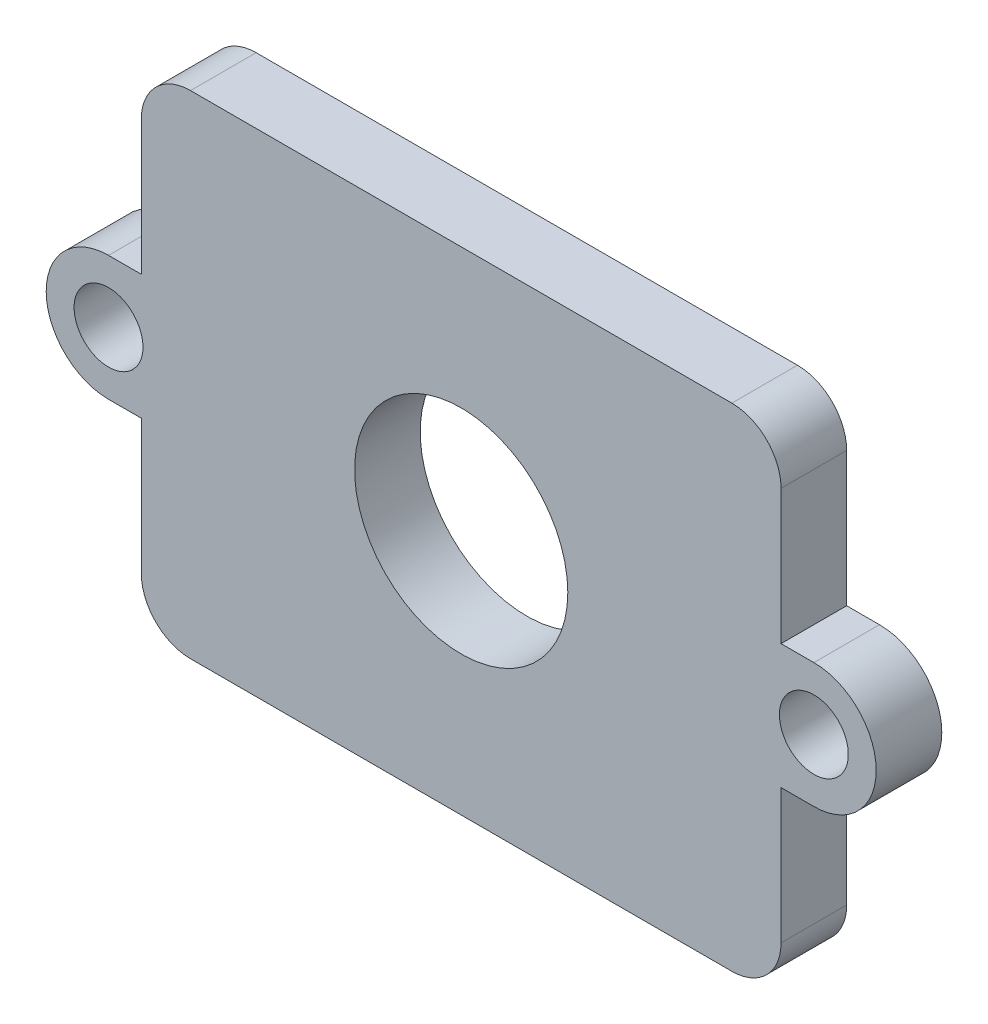
ISO-10303-21;
HEADER;
FILE_DESCRIPTION(('STEP AP214'),'2;1');
FILE_NAME('part.step','',(''),(''),'','','');
FILE_SCHEMA(('AUTOMOTIVE_DESIGN { 1 0 10303 214 1 1 1 1 }'));
ENDSEC;
DATA;
#1=APPLICATION_CONTEXT('core data for automotive mechanical design processes');
#2=APPLICATION_PROTOCOL_DEFINITION('international standard','automotive_design',2000,#1);
#3=PRODUCT_CONTEXT('',#1,'mechanical');
#4=PRODUCT('Part','Part','',(#3));
#5=PRODUCT_RELATED_PRODUCT_CATEGORY('part','',(#4));
#6=PRODUCT_DEFINITION_FORMATION('','',#4);
#7=PRODUCT_DEFINITION_CONTEXT('part definition',#1,'design');
#8=PRODUCT_DEFINITION('design','',#6,#7);
#9=PRODUCT_DEFINITION_SHAPE('','',#8);
#10=(LENGTH_UNIT() NAMED_UNIT(*) SI_UNIT(.MILLI.,.METRE.));
#11=(NAMED_UNIT(*) PLANE_ANGLE_UNIT() SI_UNIT($,.RADIAN.));
#12=(NAMED_UNIT(*) SI_UNIT($,.STERADIAN.) SOLID_ANGLE_UNIT());
#13=UNCERTAINTY_MEASURE_WITH_UNIT(LENGTH_MEASURE(1.E-05),#10,'distance_accuracy_value','');
#14=(GEOMETRIC_REPRESENTATION_CONTEXT(3) GLOBAL_UNCERTAINTY_ASSIGNED_CONTEXT((#13)) GLOBAL_UNIT_ASSIGNED_CONTEXT((#10,
#11,#12)) REPRESENTATION_CONTEXT('',''));
#15=CARTESIAN_POINT('',(0.,0.,0.));
#16=DIRECTION('',(0.,0.,1.));
#17=DIRECTION('',(1.,0.,0.));
#18=AXIS2_PLACEMENT_3D('',#15,#16,#17);
#19=CARTESIAN_POINT('',(0.,0.,4.));
#20=DIRECTION('',(0.,0.,1.));
#21=DIRECTION('',(1.,0.,0.));
#22=AXIS2_PLACEMENT_3D('',#19,#20,#21);
#23=PLANE('',#22);
#24=CARTESIAN_POINT('',(21.5,0.,4.));
#25=DIRECTION('',(0.,0.,-1.));
#26=DIRECTION('',(-1.,0.,0.));
#27=AXIS2_PLACEMENT_3D('',#24,#25,#26);
#28=CIRCLE('',#27,2.1);
#29=CARTESIAN_POINT('',(19.4,0.,4.));
#30=VERTEX_POINT('',#29);
#31=EDGE_CURVE('E332',#30,#30,#28,.T.);
#32=ORIENTED_EDGE('',*,*,#31,.T.);
#33=EDGE_LOOP('',(#32));
#34=FACE_BOUND('',#33,.T.);
#35=CARTESIAN_POINT('',(-21.5,0.,4.));
#36=DIRECTION('',(0.,0.,1.));
#37=DIRECTION('',(1.,0.,0.));
#38=AXIS2_PLACEMENT_3D('',#35,#36,#37);
#39=CIRCLE('',#38,2.1);
#40=CARTESIAN_POINT('',(-19.4,0.,4.));
#41=VERTEX_POINT('',#40);
#42=EDGE_CURVE('E326',#41,#41,#39,.T.);
#43=ORIENTED_EDGE('',*,*,#42,.F.);
#44=EDGE_LOOP('',(#43));
#45=FACE_BOUND('',#44,.T.);
#46=DIRECTION('',(1.,0.,0.));
#47=VECTOR('',#46,1.);
#48=CARTESIAN_POINT('',(-19.5,-15.,4.));
#49=LINE('',#48,#47);
#50=CARTESIAN_POINT('',(-16.5,-15.,4.));
#51=VERTEX_POINT('',#50);
#52=CARTESIAN_POINT('',(16.5,-15.,4.));
#53=VERTEX_POINT('',#52);
#54=EDGE_CURVE('E191',#51,#53,#49,.T.);
#55=ORIENTED_EDGE('',*,*,#54,.T.);
#56=CARTESIAN_POINT('',(16.5,-12.,4.));
#57=DIRECTION('',(0.,0.,1.));
#58=DIRECTION('',(1.,0.,0.));
#59=AXIS2_PLACEMENT_3D('',#56,#57,#58);
#60=CIRCLE('',#59,3.);
#61=CARTESIAN_POINT('',(19.5,-12.,4.));
#62=VERTEX_POINT('',#61);
#63=EDGE_CURVE('E257',#53,#62,#60,.T.);
#64=ORIENTED_EDGE('',*,*,#63,.T.);
#65=DIRECTION('',(0.,1.,0.));
#66=VECTOR('',#65,1.);
#67=CARTESIAN_POINT('',(19.5,-3.79999999999999,4.));
#68=LINE('',#67,#66);
#69=CARTESIAN_POINT('',(19.5,-3.79999999999999,4.));
#70=VERTEX_POINT('',#69);
#71=EDGE_CURVE('E177',#62,#70,#68,.T.);
#72=ORIENTED_EDGE('',*,*,#71,.T.);
#73=DIRECTION('',(1.,0.,0.));
#74=VECTOR('',#73,1.);
#75=CARTESIAN_POINT('',(21.5,-3.8,4.));
#76=LINE('',#75,#74);
#77=CARTESIAN_POINT('',(21.5,-3.8,4.));
#78=VERTEX_POINT('',#77);
#79=EDGE_CURVE('E166',#70,#78,#76,.T.);
#80=ORIENTED_EDGE('',*,*,#79,.T.);
#81=CARTESIAN_POINT('',(21.5,0.,4.));
#82=DIRECTION('',(0.,0.,-1.));
#83=DIRECTION('',(-1.,0.,0.));
#84=AXIS2_PLACEMENT_3D('',#81,#82,#83);
#85=CIRCLE('',#84,3.79999999999999);
#86=CARTESIAN_POINT('',(21.5,3.79999999999998,4.));
#87=VERTEX_POINT('',#86);
#88=EDGE_CURVE('E151',#87,#78,#85,.T.);
#89=ORIENTED_EDGE('',*,*,#88,.F.);
#90=DIRECTION('',(-1.,0.,0.));
#91=VECTOR('',#90,1.);
#92=CARTESIAN_POINT('',(19.5,3.79999999999999,4.));
#93=LINE('',#92,#91);
#94=CARTESIAN_POINT('',(19.5,3.79999999999999,4.));
#95=VERTEX_POINT('',#94);
#96=EDGE_CURVE('E163',#87,#95,#93,.T.);
#97=ORIENTED_EDGE('',*,*,#96,.T.);
#98=DIRECTION('',(0.,1.,0.));
#99=VECTOR('',#98,1.);
#100=CARTESIAN_POINT('',(19.5,15.,4.));
#101=LINE('',#100,#99);
#102=CARTESIAN_POINT('',(19.5,12.,4.));
#103=VERTEX_POINT('',#102);
#104=EDGE_CURVE('E173',#95,#103,#101,.T.);
#105=ORIENTED_EDGE('',*,*,#104,.T.);
#106=CARTESIAN_POINT('',(16.5,12.,4.));
#107=DIRECTION('',(0.,0.,1.));
#108=DIRECTION('',(1.,0.,0.));
#109=AXIS2_PLACEMENT_3D('',#106,#107,#108);
#110=CIRCLE('',#109,3.);
#111=CARTESIAN_POINT('',(16.5,15.,4.));
#112=VERTEX_POINT('',#111);
#113=EDGE_CURVE('E252',#103,#112,#110,.T.);
#114=ORIENTED_EDGE('',*,*,#113,.T.);
#115=DIRECTION('',(-1.,0.,0.));
#116=VECTOR('',#115,1.);
#117=CARTESIAN_POINT('',(-19.5,15.,4.));
#118=LINE('',#117,#116);
#119=CARTESIAN_POINT('',(-16.5,15.,4.));
#120=VERTEX_POINT('',#119);
#121=EDGE_CURVE('E175',#112,#120,#118,.T.);
#122=ORIENTED_EDGE('',*,*,#121,.T.);
#123=CARTESIAN_POINT('',(-16.5,12.,4.));
#124=DIRECTION('',(0.,0.,1.));
#125=DIRECTION('',(1.,0.,0.));
#126=AXIS2_PLACEMENT_3D('',#123,#124,#125);
#127=CIRCLE('',#126,3.);
#128=CARTESIAN_POINT('',(-19.5,12.,4.));
#129=VERTEX_POINT('',#128);
#130=EDGE_CURVE('E56',#120,#129,#127,.T.);
#131=ORIENTED_EDGE('',*,*,#130,.T.);
#132=DIRECTION('',(0.,-1.,0.));
#133=VECTOR('',#132,1.);
#134=CARTESIAN_POINT('',(-19.5,15.,4.));
#135=LINE('',#134,#133);
#136=CARTESIAN_POINT('',(-19.5,3.79999999999999,4.));
#137=VERTEX_POINT('',#136);
#138=EDGE_CURVE('E182',#129,#137,#135,.T.);
#139=ORIENTED_EDGE('',*,*,#138,.T.);
#140=DIRECTION('',(-1.,0.,0.));
#141=VECTOR('',#140,1.);
#142=CARTESIAN_POINT('',(-19.5,3.79999999999999,4.));
#143=LINE('',#142,#141);
#144=CARTESIAN_POINT('',(-21.5,3.79999999999999,4.));
#145=VERTEX_POINT('',#144);
#146=EDGE_CURVE('E184',#137,#145,#143,.T.);
#147=ORIENTED_EDGE('',*,*,#146,.T.);
#148=CARTESIAN_POINT('',(-21.5,0.,4.));
#149=DIRECTION('',(0.,0.,1.));
#150=DIRECTION('',(1.,0.,0.));
#151=AXIS2_PLACEMENT_3D('',#148,#149,#150);
#152=CIRCLE('',#151,3.79999999999999);
#153=CARTESIAN_POINT('',(-21.5,-3.79999999999998,4.));
#154=VERTEX_POINT('',#153);
#155=EDGE_CURVE('E291',#145,#154,#152,.T.);
#156=ORIENTED_EDGE('',*,*,#155,.T.);
#157=DIRECTION('',(1.,0.,0.));
#158=VECTOR('',#157,1.);
#159=CARTESIAN_POINT('',(-21.5,-3.79999999999998,4.));
#160=LINE('',#159,#158);
#161=CARTESIAN_POINT('',(-19.5,-3.79999999999999,4.));
#162=VERTEX_POINT('',#161);
#163=EDGE_CURVE('E187',#154,#162,#160,.T.);
#164=ORIENTED_EDGE('',*,*,#163,.T.);
#165=DIRECTION('',(0.,-1.,0.));
#166=VECTOR('',#165,1.);
#167=CARTESIAN_POINT('',(-19.5,-3.79999999999999,4.));
#168=LINE('',#167,#166);
#169=CARTESIAN_POINT('',(-19.5,-12.,4.));
#170=VERTEX_POINT('',#169);
#171=EDGE_CURVE('E189',#162,#170,#168,.T.);
#172=ORIENTED_EDGE('',*,*,#171,.T.);
#173=CARTESIAN_POINT('',(-16.5,-12.,4.));
#174=DIRECTION('',(0.,0.,1.));
#175=DIRECTION('',(1.,0.,0.));
#176=AXIS2_PLACEMENT_3D('',#173,#174,#175);
#177=CIRCLE('',#176,3.);
#178=EDGE_CURVE('E255',#170,#51,#177,.T.);
#179=ORIENTED_EDGE('',*,*,#178,.T.);
#180=EDGE_LOOP('',(#55,#64,#72,#80,#89,#97,#105,#114,#122,#131,#139,#147,#156,#164,#172,#179));
#181=FACE_BOUND('',#180,.T.);
#182=CARTESIAN_POINT('',(0.,0.,4.));
#183=DIRECTION('',(0.,0.,1.));
#184=DIRECTION('',(1.,0.,0.));
#185=AXIS2_PLACEMENT_3D('',#182,#183,#184);
#186=CIRCLE('',#185,6.5);
#187=CARTESIAN_POINT('',(6.5,0.,4.));
#188=VERTEX_POINT('',#187);
#189=EDGE_CURVE('E197',#188,#188,#186,.T.);
#190=ORIENTED_EDGE('',*,*,#189,.F.);
#191=EDGE_LOOP('',(#190));
#192=FACE_BOUND('',#191,.T.);
#193=ADVANCED_FACE('F33',(#34,#45,#181,#192),#23,.T.);
#194=CARTESIAN_POINT('',(0.,0.,0.));
#195=DIRECTION('',(0.,0.,1.));
#196=DIRECTION('',(1.,0.,0.));
#197=AXIS2_PLACEMENT_3D('',#194,#195,#196);
#198=PLANE('',#197);
#199=CARTESIAN_POINT('',(21.5,0.,0.));
#200=DIRECTION('',(0.,0.,-1.));
#201=DIRECTION('',(-1.,0.,0.));
#202=AXIS2_PLACEMENT_3D('',#199,#200,#201);
#203=CIRCLE('',#202,2.1);
#204=CARTESIAN_POINT('',(19.4,0.,0.));
#205=VERTEX_POINT('',#204);
#206=EDGE_CURVE('E168',#205,#205,#203,.T.);
#207=ORIENTED_EDGE('',*,*,#206,.F.);
#208=EDGE_LOOP('',(#207));
#209=FACE_BOUND('',#208,.T.);
#210=CARTESIAN_POINT('',(-21.5,0.,0.));
#211=DIRECTION('',(0.,0.,1.));
#212=DIRECTION('',(1.,0.,0.));
#213=AXIS2_PLACEMENT_3D('',#210,#211,#212);
#214=CIRCLE('',#213,2.1);
#215=CARTESIAN_POINT('',(-19.4,0.,0.));
#216=VERTEX_POINT('',#215);
#217=EDGE_CURVE('E295',#216,#216,#214,.T.);
#218=ORIENTED_EDGE('',*,*,#217,.T.);
#219=EDGE_LOOP('',(#218));
#220=FACE_BOUND('',#219,.T.);
#221=DIRECTION('',(0.,1.,0.));
#222=VECTOR('',#221,1.);
#223=CARTESIAN_POINT('',(19.5,-3.79999999999999,0.));
#224=LINE('',#223,#222);
#225=CARTESIAN_POINT('',(19.5,-12.,0.));
#226=VERTEX_POINT('',#225);
#227=CARTESIAN_POINT('',(19.5,-3.79999999999999,0.));
#228=VERTEX_POINT('',#227);
#229=EDGE_CURVE('E194',#226,#228,#224,.T.);
#230=ORIENTED_EDGE('',*,*,#229,.F.);
#231=CARTESIAN_POINT('',(16.5,-12.,0.));
#232=DIRECTION('',(0.,0.,1.));
#233=DIRECTION('',(1.,0.,0.));
#234=AXIS2_PLACEMENT_3D('',#231,#232,#233);
#235=CIRCLE('',#234,3.);
#236=CARTESIAN_POINT('',(16.5,-15.,0.));
#237=VERTEX_POINT('',#236);
#238=EDGE_CURVE('E245',#226,#237,#235,.F.);
#239=ORIENTED_EDGE('',*,*,#238,.T.);
#240=DIRECTION('',(1.,0.,0.));
#241=VECTOR('',#240,1.);
#242=CARTESIAN_POINT('',(-19.5,-15.,0.));
#243=LINE('',#242,#241);
#244=CARTESIAN_POINT('',(-16.5,-15.,0.));
#245=VERTEX_POINT('',#244);
#246=EDGE_CURVE('E217',#245,#237,#243,.T.);
#247=ORIENTED_EDGE('',*,*,#246,.F.);
#248=CARTESIAN_POINT('',(-16.5,-12.,0.));
#249=DIRECTION('',(0.,0.,1.));
#250=DIRECTION('',(1.,0.,0.));
#251=AXIS2_PLACEMENT_3D('',#248,#249,#250);
#252=CIRCLE('',#251,3.);
#253=CARTESIAN_POINT('',(-19.5,-12.,0.));
#254=VERTEX_POINT('',#253);
#255=EDGE_CURVE('E243',#245,#254,#252,.F.);
#256=ORIENTED_EDGE('',*,*,#255,.T.);
#257=DIRECTION('',(0.,-1.,0.));
#258=VECTOR('',#257,1.);
#259=CARTESIAN_POINT('',(-19.5,-3.79999999999999,0.));
#260=LINE('',#259,#258);
#261=CARTESIAN_POINT('',(-19.5,-3.79999999999999,0.));
#262=VERTEX_POINT('',#261);
#263=EDGE_CURVE('E215',#262,#254,#260,.T.);
#264=ORIENTED_EDGE('',*,*,#263,.F.);
#265=DIRECTION('',(1.,0.,0.));
#266=VECTOR('',#265,1.);
#267=CARTESIAN_POINT('',(-21.5,-3.79999999999998,0.));
#268=LINE('',#267,#266);
#269=CARTESIAN_POINT('',(-21.5,-3.79999999999998,0.));
#270=VERTEX_POINT('',#269);
#271=EDGE_CURVE('E213',#270,#262,#268,.T.);
#272=ORIENTED_EDGE('',*,*,#271,.F.);
#273=CARTESIAN_POINT('',(-21.5,0.,0.));
#274=DIRECTION('',(0.,0.,1.));
#275=DIRECTION('',(1.,0.,0.));
#276=AXIS2_PLACEMENT_3D('',#273,#274,#275);
#277=CIRCLE('',#276,3.79999999999999);
#278=CARTESIAN_POINT('',(-21.5,3.79999999999999,0.));
#279=VERTEX_POINT('',#278);
#280=EDGE_CURVE('E285',#270,#279,#277,.F.);
#281=ORIENTED_EDGE('',*,*,#280,.T.);
#282=DIRECTION('',(-1.,0.,0.));
#283=VECTOR('',#282,1.);
#284=CARTESIAN_POINT('',(-19.5,3.79999999999999,0.));
#285=LINE('',#284,#283);
#286=CARTESIAN_POINT('',(-19.5,3.79999999999999,0.));
#287=VERTEX_POINT('',#286);
#288=EDGE_CURVE('E210',#287,#279,#285,.T.);
#289=ORIENTED_EDGE('',*,*,#288,.F.);
#290=DIRECTION('',(0.,-1.,0.));
#291=VECTOR('',#290,1.);
#292=CARTESIAN_POINT('',(-19.5,15.,0.));
#293=LINE('',#292,#291);
#294=CARTESIAN_POINT('',(-19.5,12.,0.));
#295=VERTEX_POINT('',#294);
#296=EDGE_CURVE('E208',#295,#287,#293,.T.);
#297=ORIENTED_EDGE('',*,*,#296,.F.);
#298=CARTESIAN_POINT('',(-16.5,12.,0.));
#299=DIRECTION('',(0.,0.,1.));
#300=DIRECTION('',(1.,0.,0.));
#301=AXIS2_PLACEMENT_3D('',#298,#299,#300);
#302=CIRCLE('',#301,3.);
#303=CARTESIAN_POINT('',(-16.5,15.,0.));
#304=VERTEX_POINT('',#303);
#305=EDGE_CURVE('E241',#295,#304,#302,.F.);
#306=ORIENTED_EDGE('',*,*,#305,.T.);
#307=DIRECTION('',(-1.,0.,0.));
#308=VECTOR('',#307,1.);
#309=CARTESIAN_POINT('',(-19.5,15.,0.));
#310=LINE('',#309,#308);
#311=CARTESIAN_POINT('',(16.5,15.,0.));
#312=VERTEX_POINT('',#311);
#313=EDGE_CURVE('E205',#312,#304,#310,.T.);
#314=ORIENTED_EDGE('',*,*,#313,.F.);
#315=CARTESIAN_POINT('',(16.5,12.,0.));
#316=DIRECTION('',(0.,0.,1.));
#317=DIRECTION('',(1.,0.,0.));
#318=AXIS2_PLACEMENT_3D('',#315,#316,#317);
#319=CIRCLE('',#318,3.);
#320=CARTESIAN_POINT('',(19.5,12.,0.));
#321=VERTEX_POINT('',#320);
#322=EDGE_CURVE('E239',#312,#321,#319,.F.);
#323=ORIENTED_EDGE('',*,*,#322,.T.);
#324=DIRECTION('',(0.,1.,0.));
#325=VECTOR('',#324,1.);
#326=CARTESIAN_POINT('',(19.5,15.,0.));
#327=LINE('',#326,#325);
#328=CARTESIAN_POINT('',(19.5,3.79999999999999,0.));
#329=VERTEX_POINT('',#328);
#330=EDGE_CURVE('E202',#329,#321,#327,.T.);
#331=ORIENTED_EDGE('',*,*,#330,.F.);
#332=DIRECTION('',(-1.,0.,0.));
#333=VECTOR('',#332,1.);
#334=CARTESIAN_POINT('',(19.5,3.79999999999999,0.));
#335=LINE('',#334,#333);
#336=CARTESIAN_POINT('',(21.5,3.8,0.));
#337=VERTEX_POINT('',#336);
#338=EDGE_CURVE('E200',#337,#329,#335,.T.);
#339=ORIENTED_EDGE('',*,*,#338,.F.);
#340=CARTESIAN_POINT('',(21.5,0.,0.));
#341=DIRECTION('',(0.,0.,1.));
#342=DIRECTION('',(1.,0.,0.));
#343=AXIS2_PLACEMENT_3D('',#340,#341,#342);
#344=CIRCLE('',#343,3.79999999999999);
#345=CARTESIAN_POINT('',(21.5,-3.8,0.));
#346=VERTEX_POINT('',#345);
#347=EDGE_CURVE('E153',#346,#337,#344,.T.);
#348=ORIENTED_EDGE('',*,*,#347,.F.);
#349=DIRECTION('',(1.,0.,0.));
#350=VECTOR('',#349,1.);
#351=CARTESIAN_POINT('',(21.5,-3.8,0.));
#352=LINE('',#351,#350);
#353=EDGE_CURVE('E196',#228,#346,#352,.T.);
#354=ORIENTED_EDGE('',*,*,#353,.F.);
#355=EDGE_LOOP('',(#230,#239,#247,#256,#264,#272,#281,#289,#297,#306,#314,#323,#331,#339,#348,#354));
#356=FACE_BOUND('',#355,.T.);
#357=CARTESIAN_POINT('',(0.,0.,0.));
#358=DIRECTION('',(0.,0.,1.));
#359=DIRECTION('',(1.,0.,0.));
#360=AXIS2_PLACEMENT_3D('',#357,#358,#359);
#361=CIRCLE('',#360,6.5);
#362=CARTESIAN_POINT('',(6.5,0.,0.));
#363=VERTEX_POINT('',#362);
#364=EDGE_CURVE('E320',#363,#363,#361,.T.);
#365=ORIENTED_EDGE('',*,*,#364,.T.);
#366=EDGE_LOOP('',(#365));
#367=FACE_BOUND('',#366,.T.);
#368=ADVANCED_FACE('F282',(#209,#220,#356,#367),#198,.F.);
#369=CARTESIAN_POINT('',(19.5,-3.79999999999999,4.));
#370=DIRECTION('',(-1.,0.,0.));
#371=DIRECTION('',(0.,0.,1.));
#372=AXIS2_PLACEMENT_3D('',#369,#370,#371);
#373=PLANE('',#372);
#374=ORIENTED_EDGE('',*,*,#71,.F.);
#375=DIRECTION('',(0.,0.,-1.));
#376=VECTOR('',#375,1.);
#377=CARTESIAN_POINT('',(19.5,-12.,4.));
#378=LINE('',#377,#376);
#379=EDGE_CURVE('E236',#62,#226,#378,.T.);
#380=ORIENTED_EDGE('',*,*,#379,.T.);
#381=ORIENTED_EDGE('',*,*,#229,.T.);
#382=DIRECTION('',(0.,0.,-1.));
#383=VECTOR('',#382,1.);
#384=CARTESIAN_POINT('',(19.5,-3.79999999999999,4.));
#385=LINE('',#384,#383);
#386=EDGE_CURVE('E233',#70,#228,#385,.T.);
#387=ORIENTED_EDGE('',*,*,#386,.F.);
#388=EDGE_LOOP('',(#374,#380,#381,#387));
#389=FACE_BOUND('',#388,.T.);
#390=ADVANCED_FACE('F317',(#389),#373,.F.);
#391=CARTESIAN_POINT('',(21.5,-3.8,4.));
#392=DIRECTION('',(0.,1.,0.));
#393=DIRECTION('',(-1.,0.,0.));
#394=AXIS2_PLACEMENT_3D('',#391,#392,#393);
#395=PLANE('',#394);
#396=ORIENTED_EDGE('',*,*,#353,.T.);
#397=DIRECTION('',(0.,0.,-1.));
#398=VECTOR('',#397,1.);
#399=CARTESIAN_POINT('',(21.5,-3.8,4.));
#400=LINE('',#399,#398);
#401=EDGE_CURVE('E157',#78,#346,#400,.T.);
#402=ORIENTED_EDGE('',*,*,#401,.F.);
#403=ORIENTED_EDGE('',*,*,#79,.F.);
#404=ORIENTED_EDGE('',*,*,#386,.T.);
#405=EDGE_LOOP('',(#396,#402,#403,#404));
#406=FACE_BOUND('',#405,.T.);
#407=ADVANCED_FACE('F380',(#406),#395,.F.);
#408=CARTESIAN_POINT('',(19.5,3.79999999999999,4.));
#409=DIRECTION('',(0.,-1.,0.));
#410=DIRECTION('',(1.,0.,0.));
#411=AXIS2_PLACEMENT_3D('',#408,#409,#410);
#412=PLANE('',#411);
#413=ORIENTED_EDGE('',*,*,#338,.T.);
#414=DIRECTION('',(0.,0.,-1.));
#415=VECTOR('',#414,1.);
#416=CARTESIAN_POINT('',(19.5,3.79999999999999,4.));
#417=LINE('',#416,#415);
#418=EDGE_CURVE('E158',#95,#329,#417,.T.);
#419=ORIENTED_EDGE('',*,*,#418,.F.);
#420=ORIENTED_EDGE('',*,*,#96,.F.);
#421=DIRECTION('',(0.,0.,-1.));
#422=VECTOR('',#421,1.);
#423=CARTESIAN_POINT('',(21.5,3.8,4.));
#424=LINE('',#423,#422);
#425=EDGE_CURVE('E147',#87,#337,#424,.T.);
#426=ORIENTED_EDGE('',*,*,#425,.T.);
#427=EDGE_LOOP('',(#413,#419,#420,#426));
#428=FACE_BOUND('',#427,.T.);
#429=ADVANCED_FACE('F170',(#428),#412,.F.);
#430=CARTESIAN_POINT('',(19.5,15.,4.));
#431=DIRECTION('',(-1.,0.,0.));
#432=DIRECTION('',(0.,-1.,0.));
#433=AXIS2_PLACEMENT_3D('',#430,#431,#432);
#434=PLANE('',#433);
#435=ORIENTED_EDGE('',*,*,#330,.T.);
#436=DIRECTION('',(0.,0.,-1.));
#437=VECTOR('',#436,1.);
#438=CARTESIAN_POINT('',(19.5,12.,4.));
#439=LINE('',#438,#437);
#440=EDGE_CURVE('E11',#321,#103,#439,.F.);
#441=ORIENTED_EDGE('',*,*,#440,.T.);
#442=ORIENTED_EDGE('',*,*,#104,.F.);
#443=ORIENTED_EDGE('',*,*,#418,.T.);
#444=EDGE_LOOP('',(#435,#441,#442,#443));
#445=FACE_BOUND('',#444,.T.);
#446=ADVANCED_FACE('F374',(#445),#434,.F.);
#447=CARTESIAN_POINT('',(-19.5,15.,4.));
#448=DIRECTION('',(0.,-1.,0.));
#449=DIRECTION('',(1.,0.,0.));
#450=AXIS2_PLACEMENT_3D('',#447,#448,#449);
#451=PLANE('',#450);
#452=ORIENTED_EDGE('',*,*,#313,.T.);
#453=DIRECTION('',(0.,0.,-1.));
#454=VECTOR('',#453,1.);
#455=CARTESIAN_POINT('',(-16.5,15.,4.));
#456=LINE('',#455,#454);
#457=EDGE_CURVE('E41',#304,#120,#456,.F.);
#458=ORIENTED_EDGE('',*,*,#457,.T.);
#459=ORIENTED_EDGE('',*,*,#121,.F.);
#460=DIRECTION('',(0.,0.,-1.));
#461=VECTOR('',#460,1.);
#462=CARTESIAN_POINT('',(16.5,15.,4.));
#463=LINE('',#462,#461);
#464=EDGE_CURVE('E263',#112,#312,#463,.T.);
#465=ORIENTED_EDGE('',*,*,#464,.T.);
#466=EDGE_LOOP('',(#452,#458,#459,#465));
#467=FACE_BOUND('',#466,.T.);
#468=ADVANCED_FACE('F268',(#467),#451,.F.);
#469=CARTESIAN_POINT('',(-19.5,15.,4.));
#470=DIRECTION('',(1.,0.,0.));
#471=DIRECTION('',(0.,1.,0.));
#472=AXIS2_PLACEMENT_3D('',#469,#470,#471);
#473=PLANE('',#472);
#474=ORIENTED_EDGE('',*,*,#138,.F.);
#475=DIRECTION('',(0.,0.,-1.));
#476=VECTOR('',#475,1.);
#477=CARTESIAN_POINT('',(-19.5,12.,4.));
#478=LINE('',#477,#476);
#479=EDGE_CURVE('E260',#129,#295,#478,.T.);
#480=ORIENTED_EDGE('',*,*,#479,.T.);
#481=ORIENTED_EDGE('',*,*,#296,.T.);
#482=DIRECTION('',(0.,0.,-1.));
#483=VECTOR('',#482,1.);
#484=CARTESIAN_POINT('',(-19.5,3.79999999999999,4.));
#485=LINE('',#484,#483);
#486=EDGE_CURVE('E228',#137,#287,#485,.T.);
#487=ORIENTED_EDGE('',*,*,#486,.F.);
#488=EDGE_LOOP('',(#474,#480,#481,#487));
#489=FACE_BOUND('',#488,.T.);
#490=ADVANCED_FACE('F277',(#489),#473,.F.);
#491=CARTESIAN_POINT('',(-19.5,3.79999999999999,4.));
#492=DIRECTION('',(0.,-1.,0.));
#493=DIRECTION('',(1.,0.,0.));
#494=AXIS2_PLACEMENT_3D('',#491,#492,#493);
#495=PLANE('',#494);
#496=ORIENTED_EDGE('',*,*,#288,.T.);
#497=DIRECTION('',(0.,0.,-1.));
#498=VECTOR('',#497,1.);
#499=CARTESIAN_POINT('',(-21.5,3.79999999999999,4.));
#500=LINE('',#499,#498);
#501=EDGE_CURVE('E225',#145,#279,#500,.T.);
#502=ORIENTED_EDGE('',*,*,#501,.F.);
#503=ORIENTED_EDGE('',*,*,#146,.F.);
#504=ORIENTED_EDGE('',*,*,#486,.T.);
#505=EDGE_LOOP('',(#496,#502,#503,#504));
#506=FACE_BOUND('',#505,.T.);
#507=ADVANCED_FACE('F288',(#506),#495,.F.);
#508=CARTESIAN_POINT('',(-21.5,-3.79999999999998,4.));
#509=DIRECTION('',(0.,1.,0.));
#510=DIRECTION('',(-1.,0.,0.));
#511=AXIS2_PLACEMENT_3D('',#508,#509,#510);
#512=PLANE('',#511);
#513=ORIENTED_EDGE('',*,*,#271,.T.);
#514=DIRECTION('',(0.,0.,-1.));
#515=VECTOR('',#514,1.);
#516=CARTESIAN_POINT('',(-19.5,-3.79999999999999,4.));
#517=LINE('',#516,#515);
#518=EDGE_CURVE('E193',#162,#262,#517,.T.);
#519=ORIENTED_EDGE('',*,*,#518,.F.);
#520=ORIENTED_EDGE('',*,*,#163,.F.);
#521=DIRECTION('',(0.,0.,-1.));
#522=VECTOR('',#521,1.);
#523=CARTESIAN_POINT('',(-21.5,-3.79999999999998,4.));
#524=LINE('',#523,#522);
#525=EDGE_CURVE('E222',#154,#270,#524,.T.);
#526=ORIENTED_EDGE('',*,*,#525,.T.);
#527=EDGE_LOOP('',(#513,#519,#520,#526));
#528=FACE_BOUND('',#527,.T.);
#529=ADVANCED_FACE('F298',(#528),#512,.F.);
#530=CARTESIAN_POINT('',(-19.5,-3.79999999999999,4.));
#531=DIRECTION('',(1.,0.,0.));
#532=DIRECTION('',(0.,1.,0.));
#533=AXIS2_PLACEMENT_3D('',#530,#531,#532);
#534=PLANE('',#533);
#535=ORIENTED_EDGE('',*,*,#263,.T.);
#536=DIRECTION('',(0.,0.,-1.));
#537=VECTOR('',#536,1.);
#538=CARTESIAN_POINT('',(-19.5,-12.,4.));
#539=LINE('',#538,#537);
#540=EDGE_CURVE('E48',#254,#170,#539,.F.);
#541=ORIENTED_EDGE('',*,*,#540,.T.);
#542=ORIENTED_EDGE('',*,*,#171,.F.);
#543=ORIENTED_EDGE('',*,*,#518,.T.);
#544=EDGE_LOOP('',(#535,#541,#542,#543));
#545=FACE_BOUND('',#544,.T.);
#546=ADVANCED_FACE('F300',(#545),#534,.F.);
#547=CARTESIAN_POINT('',(-19.5,-15.,4.));
#548=DIRECTION('',(0.,1.,0.));
#549=DIRECTION('',(-1.,0.,0.));
#550=AXIS2_PLACEMENT_3D('',#547,#548,#549);
#551=PLANE('',#550);
#552=ORIENTED_EDGE('',*,*,#246,.T.);
#553=DIRECTION('',(0.,0.,-1.));
#554=VECTOR('',#553,1.);
#555=CARTESIAN_POINT('',(16.5,-15.,4.));
#556=LINE('',#555,#554);
#557=EDGE_CURVE('E250',#237,#53,#556,.F.);
#558=ORIENTED_EDGE('',*,*,#557,.T.);
#559=ORIENTED_EDGE('',*,*,#54,.F.);
#560=DIRECTION('',(0.,0.,-1.));
#561=VECTOR('',#560,1.);
#562=CARTESIAN_POINT('',(-16.5,-15.,4.));
#563=LINE('',#562,#561);
#564=EDGE_CURVE('E247',#51,#245,#563,.T.);
#565=ORIENTED_EDGE('',*,*,#564,.T.);
#566=EDGE_LOOP('',(#552,#558,#559,#565));
#567=FACE_BOUND('',#566,.T.);
#568=ADVANCED_FACE('F308',(#567),#551,.F.);
#569=CARTESIAN_POINT('',(0.,0.,4.));
#570=DIRECTION('',(0.,0.,-1.));
#571=DIRECTION('',(-1.,0.,0.));
#572=AXIS2_PLACEMENT_3D('',#569,#570,#571);
#573=CYLINDRICAL_SURFACE('',#572,6.5);
#574=ORIENTED_EDGE('',*,*,#189,.T.);
#575=EDGE_LOOP('',(#574));
#576=FACE_BOUND('',#575,.T.);
#577=ORIENTED_EDGE('',*,*,#364,.F.);
#578=EDGE_LOOP('',(#577));
#579=FACE_BOUND('',#578,.T.);
#580=ADVANCED_FACE('F359',(#576,#579),#573,.F.);
#581=CARTESIAN_POINT('',(-21.5,0.,-8.49705831449917));
#582=DIRECTION('',(0.,0.,1.));
#583=DIRECTION('',(1.,0.,0.));
#584=AXIS2_PLACEMENT_3D('',#581,#582,#583);
#585=CYLINDRICAL_SURFACE('',#584,3.79999999999999);
#586=ORIENTED_EDGE('',*,*,#280,.F.);
#587=ORIENTED_EDGE('',*,*,#525,.F.);
#588=ORIENTED_EDGE('',*,*,#155,.F.);
#589=ORIENTED_EDGE('',*,*,#501,.T.);
#590=EDGE_LOOP('',(#586,#587,#588,#589));
#591=FACE_BOUND('',#590,.T.);
#592=ADVANCED_FACE('F349',(#591),#585,.T.);
#593=CARTESIAN_POINT('',(-21.5,0.,0.));
#594=DIRECTION('',(0.,0.,1.));
#595=DIRECTION('',(1.,0.,0.));
#596=AXIS2_PLACEMENT_3D('',#593,#594,#595);
#597=CYLINDRICAL_SURFACE('',#596,2.1);
#598=ORIENTED_EDGE('',*,*,#217,.F.);
#599=EDGE_LOOP('',(#598));
#600=FACE_BOUND('',#599,.T.);
#601=ORIENTED_EDGE('',*,*,#42,.T.);
#602=EDGE_LOOP('',(#601));
#603=FACE_BOUND('',#602,.T.);
#604=ADVANCED_FACE('F346',(#600,#603),#597,.F.);
#605=CARTESIAN_POINT('',(21.5,0.,-8.49705831449917));
#606=DIRECTION('',(0.,0.,1.));
#607=DIRECTION('',(1.,0.,0.));
#608=AXIS2_PLACEMENT_3D('',#605,#606,#607);
#609=CYLINDRICAL_SURFACE('',#608,3.79999999999999);
#610=ORIENTED_EDGE('',*,*,#401,.T.);
#611=ORIENTED_EDGE('',*,*,#347,.T.);
#612=ORIENTED_EDGE('',*,*,#425,.F.);
#613=ORIENTED_EDGE('',*,*,#88,.T.);
#614=EDGE_LOOP('',(#610,#611,#612,#613));
#615=FACE_BOUND('',#614,.T.);
#616=ADVANCED_FACE('F150',(#615),#609,.T.);
#617=CARTESIAN_POINT('',(21.5,0.,0.));
#618=DIRECTION('',(0.,0.,1.));
#619=DIRECTION('',(1.,0.,0.));
#620=AXIS2_PLACEMENT_3D('',#617,#618,#619);
#621=CYLINDRICAL_SURFACE('',#620,2.1);
#622=ORIENTED_EDGE('',*,*,#206,.T.);
#623=EDGE_LOOP('',(#622));
#624=FACE_BOUND('',#623,.T.);
#625=ORIENTED_EDGE('',*,*,#31,.F.);
#626=EDGE_LOOP('',(#625));
#627=FACE_BOUND('',#626,.T.);
#628=ADVANCED_FACE('F338',(#624,#627),#621,.F.);
#629=CARTESIAN_POINT('',(16.5,-12.,4.));
#630=DIRECTION('',(0.,0.,-1.));
#631=DIRECTION('',(-1.,0.,0.));
#632=AXIS2_PLACEMENT_3D('',#629,#630,#631);
#633=CYLINDRICAL_SURFACE('',#632,3.);
#634=ORIENTED_EDGE('',*,*,#63,.F.);
#635=ORIENTED_EDGE('',*,*,#557,.F.);
#636=ORIENTED_EDGE('',*,*,#238,.F.);
#637=ORIENTED_EDGE('',*,*,#379,.F.);
#638=EDGE_LOOP('',(#634,#635,#636,#637));
#639=FACE_BOUND('',#638,.T.);
#640=ADVANCED_FACE('F314',(#639),#633,.T.);
#641=CARTESIAN_POINT('',(-16.5,-12.,4.));
#642=DIRECTION('',(0.,0.,-1.));
#643=DIRECTION('',(-1.,0.,0.));
#644=AXIS2_PLACEMENT_3D('',#641,#642,#643);
#645=CYLINDRICAL_SURFACE('',#644,3.);
#646=ORIENTED_EDGE('',*,*,#178,.F.);
#647=ORIENTED_EDGE('',*,*,#540,.F.);
#648=ORIENTED_EDGE('',*,*,#255,.F.);
#649=ORIENTED_EDGE('',*,*,#564,.F.);
#650=EDGE_LOOP('',(#646,#647,#648,#649));
#651=FACE_BOUND('',#650,.T.);
#652=ADVANCED_FACE('F305',(#651),#645,.T.);
#653=CARTESIAN_POINT('',(-16.5,12.,4.));
#654=DIRECTION('',(0.,0.,-1.));
#655=DIRECTION('',(-1.,0.,0.));
#656=AXIS2_PLACEMENT_3D('',#653,#654,#655);
#657=CYLINDRICAL_SURFACE('',#656,3.);
#658=ORIENTED_EDGE('',*,*,#130,.F.);
#659=ORIENTED_EDGE('',*,*,#457,.F.);
#660=ORIENTED_EDGE('',*,*,#305,.F.);
#661=ORIENTED_EDGE('',*,*,#479,.F.);
#662=EDGE_LOOP('',(#658,#659,#660,#661));
#663=FACE_BOUND('',#662,.T.);
#664=ADVANCED_FACE('F274',(#663),#657,.T.);
#665=CARTESIAN_POINT('',(16.5,12.,4.));
#666=DIRECTION('',(0.,0.,-1.));
#667=DIRECTION('',(-1.,0.,0.));
#668=AXIS2_PLACEMENT_3D('',#665,#666,#667);
#669=CYLINDRICAL_SURFACE('',#668,3.);
#670=ORIENTED_EDGE('',*,*,#113,.F.);
#671=ORIENTED_EDGE('',*,*,#440,.F.);
#672=ORIENTED_EDGE('',*,*,#322,.F.);
#673=ORIENTED_EDGE('',*,*,#464,.F.);
#674=EDGE_LOOP('',(#670,#671,#672,#673));
#675=FACE_BOUND('',#674,.T.);
#676=ADVANCED_FACE('F35',(#675),#669,.T.);
#677=CLOSED_SHELL('',(#193,#368,#390,#407,#429,#446,#468,#490,#507,#529,#546,#568,#580,#592,
#604,#616,#628,#640,#652,#664,#676));
#678=MANIFOLD_SOLID_BREP('B2',#677);
#679=ADVANCED_BREP_SHAPE_REPRESENTATION('',(#18,#678),#14);
#680=SHAPE_DEFINITION_REPRESENTATION(#9,#679);
ENDSEC;
END-ISO-10303-21;
